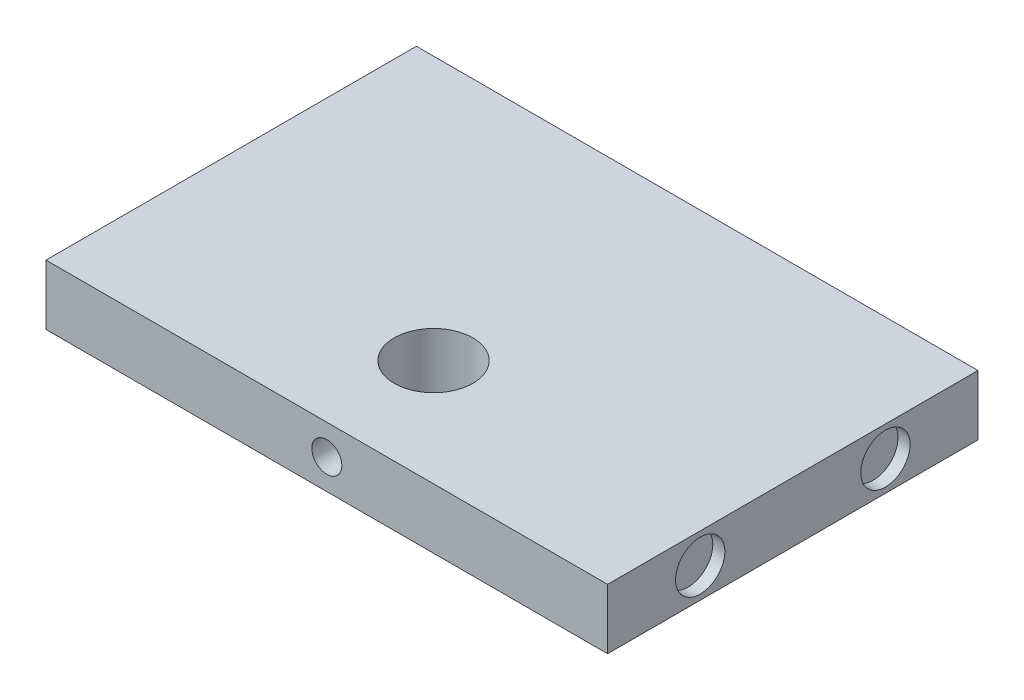
ISO-10303-21;
HEADER;
FILE_DESCRIPTION(('STEP AP214'),'2;1');
FILE_NAME('part.step','',(''),(''),'','','');
FILE_SCHEMA(('AUTOMOTIVE_DESIGN { 1 0 10303 214 1 1 1 1 }'));
ENDSEC;
DATA;
#1=APPLICATION_CONTEXT('core data for automotive mechanical design processes');
#2=APPLICATION_PROTOCOL_DEFINITION('international standard','automotive_design',2000,#1);
#3=PRODUCT_CONTEXT('',#1,'mechanical');
#4=PRODUCT('Part','Part','',(#3));
#5=PRODUCT_RELATED_PRODUCT_CATEGORY('part','',(#4));
#6=PRODUCT_DEFINITION_FORMATION('','',#4);
#7=PRODUCT_DEFINITION_CONTEXT('part definition',#1,'design');
#8=PRODUCT_DEFINITION('design','',#6,#7);
#9=PRODUCT_DEFINITION_SHAPE('','',#8);
#10=(LENGTH_UNIT() NAMED_UNIT(*) SI_UNIT(.MILLI.,.METRE.));
#11=(NAMED_UNIT(*) PLANE_ANGLE_UNIT() SI_UNIT($,.RADIAN.));
#12=(NAMED_UNIT(*) SI_UNIT($,.STERADIAN.) SOLID_ANGLE_UNIT());
#13=UNCERTAINTY_MEASURE_WITH_UNIT(LENGTH_MEASURE(1.E-05),#10,'distance_accuracy_value','');
#14=(GEOMETRIC_REPRESENTATION_CONTEXT(3) GLOBAL_UNCERTAINTY_ASSIGNED_CONTEXT((#13)) GLOBAL_UNIT_ASSIGNED_CONTEXT((#10,
#11,#12)) REPRESENTATION_CONTEXT('',''));
#15=CARTESIAN_POINT('',(0.,0.,0.));
#16=DIRECTION('',(0.,0.,1.));
#17=DIRECTION('',(1.,0.,0.));
#18=AXIS2_PLACEMENT_3D('',#15,#16,#17);
#19=CARTESIAN_POINT('',(0.,10.,0.));
#20=DIRECTION('',(0.,1.,0.));
#21=DIRECTION('',(0.,0.,1.));
#22=AXIS2_PLACEMENT_3D('',#19,#20,#21);
#23=PLANE('',#22);
#24=DIRECTION('',(0.,0.,1.));
#25=VECTOR('',#24,1.);
#26=CARTESIAN_POINT('',(-46.7,10.,30.8));
#27=LINE('',#26,#25);
#28=CARTESIAN_POINT('',(-46.7,10.,-30.8));
#29=VERTEX_POINT('',#28);
#30=CARTESIAN_POINT('',(-46.7,10.,30.8));
#31=VERTEX_POINT('',#30);
#32=EDGE_CURVE('E91',#29,#31,#27,.T.);
#33=ORIENTED_EDGE('',*,*,#32,.T.);
#34=DIRECTION('',(1.,0.,0.));
#35=VECTOR('',#34,1.);
#36=CARTESIAN_POINT('',(46.7,10.,30.8));
#37=LINE('',#36,#35);
#38=CARTESIAN_POINT('',(46.7,10.,30.8));
#39=VERTEX_POINT('',#38);
#40=EDGE_CURVE('E86',#31,#39,#37,.T.);
#41=ORIENTED_EDGE('',*,*,#40,.T.);
#42=DIRECTION('',(0.,0.,-1.));
#43=VECTOR('',#42,1.);
#44=CARTESIAN_POINT('',(46.7,10.,30.8));
#45=LINE('',#44,#43);
#46=CARTESIAN_POINT('',(46.7,10.,-30.8));
#47=VERTEX_POINT('',#46);
#48=EDGE_CURVE('E89',#39,#47,#45,.T.);
#49=ORIENTED_EDGE('',*,*,#48,.T.);
#50=DIRECTION('',(-1.,0.,0.));
#51=VECTOR('',#50,1.);
#52=CARTESIAN_POINT('',(46.7,10.,-30.8));
#53=LINE('',#52,#51);
#54=EDGE_CURVE('E56',#47,#29,#53,.T.);
#55=ORIENTED_EDGE('',*,*,#54,.T.);
#56=EDGE_LOOP('',(#33,#41,#49,#55));
#57=FACE_BOUND('',#56,.T.);
#58=CARTESIAN_POINT('',(0.,10.,13.05));
#59=DIRECTION('',(0.,1.,0.));
#60=DIRECTION('',(0.,0.,1.));
#61=AXIS2_PLACEMENT_3D('',#58,#59,#60);
#62=CIRCLE('',#61,6.55);
#63=CARTESIAN_POINT('',(0.,10.,19.6));
#64=VERTEX_POINT('',#63);
#65=EDGE_CURVE('E106',#64,#64,#62,.T.);
#66=ORIENTED_EDGE('',*,*,#65,.F.);
#67=EDGE_LOOP('',(#66));
#68=FACE_BOUND('',#67,.T.);
#69=ADVANCED_FACE('F39',(#57,#68),#23,.T.);
#70=CARTESIAN_POINT('',(0.,0.,0.));
#71=DIRECTION('',(0.,1.,0.));
#72=DIRECTION('',(0.,0.,1.));
#73=AXIS2_PLACEMENT_3D('',#70,#71,#72);
#74=PLANE('',#73);
#75=DIRECTION('',(0.,0.,1.));
#76=VECTOR('',#75,1.);
#77=CARTESIAN_POINT('',(-46.7,0.,30.8));
#78=LINE('',#77,#76);
#79=CARTESIAN_POINT('',(-46.7,0.,-30.8));
#80=VERTEX_POINT('',#79);
#81=CARTESIAN_POINT('',(-46.7,0.,30.8));
#82=VERTEX_POINT('',#81);
#83=EDGE_CURVE('E103',#80,#82,#78,.T.);
#84=ORIENTED_EDGE('',*,*,#83,.F.);
#85=DIRECTION('',(-1.,0.,0.));
#86=VECTOR('',#85,1.);
#87=CARTESIAN_POINT('',(46.7,0.,-30.8));
#88=LINE('',#87,#86);
#89=CARTESIAN_POINT('',(46.7,0.,-30.8));
#90=VERTEX_POINT('',#89);
#91=EDGE_CURVE('E79',#90,#80,#88,.T.);
#92=ORIENTED_EDGE('',*,*,#91,.F.);
#93=DIRECTION('',(0.,0.,-1.));
#94=VECTOR('',#93,1.);
#95=CARTESIAN_POINT('',(46.7,0.,30.8));
#96=LINE('',#95,#94);
#97=CARTESIAN_POINT('',(46.7,0.,30.8));
#98=VERTEX_POINT('',#97);
#99=EDGE_CURVE('E73',#98,#90,#96,.T.);
#100=ORIENTED_EDGE('',*,*,#99,.F.);
#101=DIRECTION('',(1.,0.,0.));
#102=VECTOR('',#101,1.);
#103=CARTESIAN_POINT('',(46.7,0.,30.8));
#104=LINE('',#103,#102);
#105=EDGE_CURVE('E95',#82,#98,#104,.T.);
#106=ORIENTED_EDGE('',*,*,#105,.F.);
#107=EDGE_LOOP('',(#84,#92,#100,#106));
#108=FACE_BOUND('',#107,.T.);
#109=CARTESIAN_POINT('',(0.,0.,13.05));
#110=DIRECTION('',(0.,1.,0.));
#111=DIRECTION('',(0.,0.,1.));
#112=AXIS2_PLACEMENT_3D('',#109,#110,#111);
#113=CIRCLE('',#112,6.55);
#114=CARTESIAN_POINT('',(0.,0.,19.6));
#115=VERTEX_POINT('',#114);
#116=EDGE_CURVE('E118',#115,#115,#113,.T.);
#117=ORIENTED_EDGE('',*,*,#116,.T.);
#118=EDGE_LOOP('',(#117));
#119=FACE_BOUND('',#118,.T.);
#120=ADVANCED_FACE('F114',(#108,#119),#74,.F.);
#121=CARTESIAN_POINT('',(-46.7,10.,30.8));
#122=DIRECTION('',(1.,0.,0.));
#123=DIRECTION('',(0.,0.,-1.));
#124=AXIS2_PLACEMENT_3D('',#121,#122,#123);
#125=PLANE('',#124);
#126=CARTESIAN_POINT('',(-46.7,5.,-15.4));
#127=DIRECTION('',(-1.,0.,0.));
#128=DIRECTION('',(0.,0.,1.));
#129=AXIS2_PLACEMENT_3D('',#126,#127,#128);
#130=CIRCLE('',#129,4.1);
#131=CARTESIAN_POINT('',(-46.7,5.,-11.3));
#132=VERTEX_POINT('',#131);
#133=EDGE_CURVE('E131',#132,#132,#130,.T.);
#134=ORIENTED_EDGE('',*,*,#133,.F.);
#135=EDGE_LOOP('',(#134));
#136=FACE_BOUND('',#135,.T.);
#137=CARTESIAN_POINT('',(-46.7,5.,15.4));
#138=DIRECTION('',(-1.,0.,0.));
#139=DIRECTION('',(0.,0.,-1.));
#140=AXIS2_PLACEMENT_3D('',#137,#138,#139);
#141=CIRCLE('',#140,4.1);
#142=CARTESIAN_POINT('',(-46.7,5.,11.3));
#143=VERTEX_POINT('',#142);
#144=EDGE_CURVE('E127',#143,#143,#141,.T.);
#145=ORIENTED_EDGE('',*,*,#144,.F.);
#146=EDGE_LOOP('',(#145));
#147=FACE_BOUND('',#146,.T.);
#148=ORIENTED_EDGE('',*,*,#83,.T.);
#149=DIRECTION('',(0.,-1.,0.));
#150=VECTOR('',#149,1.);
#151=CARTESIAN_POINT('',(-46.7,10.,30.8));
#152=LINE('',#151,#150);
#153=EDGE_CURVE('E11',#31,#82,#152,.T.);
#154=ORIENTED_EDGE('',*,*,#153,.F.);
#155=ORIENTED_EDGE('',*,*,#32,.F.);
#156=DIRECTION('',(0.,-1.,0.));
#157=VECTOR('',#156,1.);
#158=CARTESIAN_POINT('',(-46.7,10.,-30.8));
#159=LINE('',#158,#157);
#160=EDGE_CURVE('E99',#29,#80,#159,.T.);
#161=ORIENTED_EDGE('',*,*,#160,.T.);
#162=EDGE_LOOP('',(#148,#154,#155,#161));
#163=FACE_BOUND('',#162,.T.);
#164=ADVANCED_FACE('F41',(#136,#147,#163),#125,.F.);
#165=CARTESIAN_POINT('',(46.7,10.,30.8));
#166=DIRECTION('',(0.,0.,-1.));
#167=DIRECTION('',(-1.,0.,0.));
#168=AXIS2_PLACEMENT_3D('',#165,#166,#167);
#169=PLANE('',#168);
#170=CARTESIAN_POINT('',(0.,5.,30.8));
#171=DIRECTION('',(0.,0.,1.));
#172=DIRECTION('',(1.,0.,0.));
#173=AXIS2_PLACEMENT_3D('',#170,#171,#172);
#174=CIRCLE('',#173,2.5);
#175=CARTESIAN_POINT('',(2.5,5.,30.8));
#176=VERTEX_POINT('',#175);
#177=EDGE_CURVE('E140',#176,#176,#174,.T.);
#178=ORIENTED_EDGE('',*,*,#177,.F.);
#179=EDGE_LOOP('',(#178));
#180=FACE_BOUND('',#179,.T.);
#181=ORIENTED_EDGE('',*,*,#105,.T.);
#182=DIRECTION('',(0.,-1.,0.));
#183=VECTOR('',#182,1.);
#184=CARTESIAN_POINT('',(46.7,10.,30.8));
#185=LINE('',#184,#183);
#186=EDGE_CURVE('E48',#39,#98,#185,.T.);
#187=ORIENTED_EDGE('',*,*,#186,.F.);
#188=ORIENTED_EDGE('',*,*,#40,.F.);
#189=ORIENTED_EDGE('',*,*,#153,.T.);
#190=EDGE_LOOP('',(#181,#187,#188,#189));
#191=FACE_BOUND('',#190,.T.);
#192=ADVANCED_FACE('F94',(#180,#191),#169,.F.);
#193=CARTESIAN_POINT('',(46.7,10.,30.8));
#194=DIRECTION('',(-1.,0.,0.));
#195=DIRECTION('',(0.,0.,1.));
#196=AXIS2_PLACEMENT_3D('',#193,#194,#195);
#197=PLANE('',#196);
#198=CARTESIAN_POINT('',(46.7,5.,-15.4));
#199=DIRECTION('',(-1.,0.,0.));
#200=DIRECTION('',(0.,0.,1.));
#201=AXIS2_PLACEMENT_3D('',#198,#199,#200);
#202=CIRCLE('',#201,4.1);
#203=CARTESIAN_POINT('',(46.7,5.,-11.3));
#204=VERTEX_POINT('',#203);
#205=EDGE_CURVE('E143',#204,#204,#202,.T.);
#206=ORIENTED_EDGE('',*,*,#205,.T.);
#207=EDGE_LOOP('',(#206));
#208=FACE_BOUND('',#207,.T.);
#209=CARTESIAN_POINT('',(46.7,5.,15.4));
#210=DIRECTION('',(-1.,0.,0.));
#211=DIRECTION('',(0.,0.,-1.));
#212=AXIS2_PLACEMENT_3D('',#209,#210,#211);
#213=CIRCLE('',#212,4.1);
#214=CARTESIAN_POINT('',(46.7,5.,11.3));
#215=VERTEX_POINT('',#214);
#216=EDGE_CURVE('E136',#215,#215,#213,.T.);
#217=ORIENTED_EDGE('',*,*,#216,.T.);
#218=EDGE_LOOP('',(#217));
#219=FACE_BOUND('',#218,.T.);
#220=ORIENTED_EDGE('',*,*,#99,.T.);
#221=DIRECTION('',(0.,-1.,0.));
#222=VECTOR('',#221,1.);
#223=CARTESIAN_POINT('',(46.7,10.,-30.8));
#224=LINE('',#223,#222);
#225=EDGE_CURVE('E96',#47,#90,#224,.T.);
#226=ORIENTED_EDGE('',*,*,#225,.F.);
#227=ORIENTED_EDGE('',*,*,#48,.F.);
#228=ORIENTED_EDGE('',*,*,#186,.T.);
#229=EDGE_LOOP('',(#220,#226,#227,#228));
#230=FACE_BOUND('',#229,.T.);
#231=ADVANCED_FACE('F97',(#208,#219,#230),#197,.F.);
#232=CARTESIAN_POINT('',(46.7,10.,-30.8));
#233=DIRECTION('',(0.,0.,1.));
#234=DIRECTION('',(1.,0.,0.));
#235=AXIS2_PLACEMENT_3D('',#232,#233,#234);
#236=PLANE('',#235);
#237=ORIENTED_EDGE('',*,*,#91,.T.);
#238=ORIENTED_EDGE('',*,*,#160,.F.);
#239=ORIENTED_EDGE('',*,*,#54,.F.);
#240=ORIENTED_EDGE('',*,*,#225,.T.);
#241=EDGE_LOOP('',(#237,#238,#239,#240));
#242=FACE_BOUND('',#241,.T.);
#243=ADVANCED_FACE('F111',(#242),#236,.F.);
#244=CARTESIAN_POINT('',(0.,10.,13.05));
#245=DIRECTION('',(0.,-1.,0.));
#246=DIRECTION('',(0.,0.,-1.));
#247=AXIS2_PLACEMENT_3D('',#244,#245,#246);
#248=CYLINDRICAL_SURFACE('',#247,6.55);
#249=CARTESIAN_POINT('',(2.5,5.,19.1041308211832));
#250=CARTESIAN_POINT('',(2.50000597581389,5.13481281669022,19.1041251320415));
#251=CARTESIAN_POINT('',(2.48905920182154,5.26958712159651,19.1086826060039));
#252=CARTESIAN_POINT('',(2.44577025817923,5.53506075248647,19.126285799445));
#253=CARTESIAN_POINT('',(2.41342931566333,5.66576031174058,19.1393310320792));
#254=CARTESIAN_POINT('',(2.3287209699945,5.91917208605854,19.1722213180272));
#255=CARTESIAN_POINT('',(2.27640310736123,6.04190318804779,19.1920495377319));
#256=CARTESIAN_POINT('',(2.1534023939893,6.27689460982429,19.2362440675147));
#257=CARTESIAN_POINT('',(2.08271382214451,6.38915165289608,19.2606117906389));
#258=CARTESIAN_POINT('',(1.92107731524571,6.60579321022366,19.3125461951997));
#259=CARTESIAN_POINT('',(1.82933517438893,6.70956221693971,19.3402092767056));
#260=CARTESIAN_POINT('',(1.62987918120905,6.90067822438357,19.3948149036664));
#261=CARTESIAN_POINT('',(1.52216177204387,6.98802155814075,19.4217572870795));
#262=CARTESIAN_POINT('',(1.28911144265205,7.14680204186814,19.4730369092061));
#263=CARTESIAN_POINT('',(1.16328961702604,7.21756598639166,19.4972480255216));
#264=CARTESIAN_POINT('',(0.900439156402321,7.33666540476869,19.5391743385083));
#265=CARTESIAN_POINT('',(0.763414579941273,7.38500895910847,19.5568918750336));
#266=CARTESIAN_POINT('',(0.488522121510804,7.45572407304055,19.5831500801332));
#267=CARTESIAN_POINT('',(0.3509634475184,7.4791562155726,19.5920642311101));
#268=CARTESIAN_POINT('',(0.0735966964608953,7.50278604566727,19.6010541407955));
#269=CARTESIAN_POINT('',(-0.0662106069796278,7.50299156011752,19.6011328768539));
#270=CARTESIAN_POINT('',(-0.336487416487367,7.48077043552324,19.5926779490987));
#271=CARTESIAN_POINT('',(-0.467068407753809,7.45950253946783,19.5845852299131));
#272=CARTESIAN_POINT('',(-0.722646071755101,7.39689318761337,19.5612792282279));
#273=CARTESIAN_POINT('',(-0.8476423468851,7.35555030505106,19.5460654396246));
#274=CARTESIAN_POINT('',(-1.09069041552946,7.2534485021302,19.5097390414119));
#275=CARTESIAN_POINT('',(-1.20861292996744,7.19241278323093,19.4885429118616));
#276=CARTESIAN_POINT('',(-1.43283834237801,7.05290642555019,19.4423859395392));
#277=CARTESIAN_POINT('',(-1.53913740415186,6.9744300564228,19.4174238602844));
#278=CARTESIAN_POINT('',(-1.74390862760734,6.79673310475465,19.3645179435542));
#279=CARTESIAN_POINT('',(-1.841520185764,6.69654583186291,19.3364850736439));
#280=CARTESIAN_POINT('',(-2.0188883154685,6.4810706029197,19.2817914138271));
#281=CARTESIAN_POINT('',(-2.09864006507836,6.36577858204924,19.2551309959592));
#282=CARTESIAN_POINT('',(-2.23975174693389,6.11985352546305,19.2056279002759));
#283=CARTESIAN_POINT('',(-2.30063071682444,5.98892154114034,19.1828907420823));
#284=CARTESIAN_POINT('',(-2.39914570126494,5.71756656344801,19.1450322859471));
#285=CARTESIAN_POINT('',(-2.43679521025293,5.5771491330597,19.1299065673185));
#286=CARTESIAN_POINT('',(-2.48578944738378,5.29933699637517,19.1100342088773));
#287=CARTESIAN_POINT('',(-2.49850624696311,5.16222328303433,19.1047470621767));
#288=CARTESIAN_POINT('',(-2.50124402276495,4.88774917342692,19.103617700945));
#289=CARTESIAN_POINT('',(-2.49127096958449,4.75038885155675,19.1077730017323));
#290=CARTESIAN_POINT('',(-2.45015765264515,4.48650693974699,19.124509846915));
#291=CARTESIAN_POINT('',(-2.42009797483307,4.35978646216391,19.1366607708259));
#292=CARTESIAN_POINT('',(-2.34103527083642,4.11325243138241,19.1675028724459));
#293=CARTESIAN_POINT('',(-2.29202827945532,3.9934403299686,19.1861954190744));
#294=CARTESIAN_POINT('',(-2.17435199386903,3.75901169220988,19.2288949810422));
#295=CARTESIAN_POINT('',(-2.1050008678604,3.64477048786686,19.2530782800991));
#296=CARTESIAN_POINT('',(-1.94932275902907,3.42906137993536,19.3037455494887));
#297=CARTESIAN_POINT('',(-1.862989372714,3.32759831833927,19.3302303855515));
#298=CARTESIAN_POINT('',(-1.66904958238838,3.13336552943563,19.3846314795537));
#299=CARTESIAN_POINT('',(-1.56041431040615,3.04161358845547,19.4125266513203));
#300=CARTESIAN_POINT('',(-1.32860850902128,2.87751062945112,19.4649358177479));
#301=CARTESIAN_POINT('',(-1.20543780292961,2.80515984729747,19.4894497712999));
#302=CARTESIAN_POINT('',(-0.948013261440525,2.68234098711379,19.53233991708));
#303=CARTESIAN_POINT('',(-0.813790337851832,2.63181418960797,19.5507325482738));
#304=CARTESIAN_POINT('',(-0.537884368398438,2.5543541233138,19.5793470958823));
#305=CARTESIAN_POINT('',(-0.396205006654785,2.52740931688655,19.5895730077018));
#306=CARTESIAN_POINT('',(-0.1185907359226,2.49915534878287,19.6003107732321));
#307=CARTESIAN_POINT('',(0.0171772973662682,2.49640207572364,19.6013697838267));
#308=CARTESIAN_POINT('',(0.287162251523454,2.51286877509592,19.5950945268615));
#309=CARTESIAN_POINT('',(0.421379368776751,2.53208593402608,19.587761333995));
#310=CARTESIAN_POINT('',(0.680899977029763,2.59092812313427,19.5657818917338));
#311=CARTESIAN_POINT('',(0.80634447747272,2.63000971347147,19.5513306831159));
#312=CARTESIAN_POINT('',(1.04889763757919,2.72692269082992,19.5166327923829));
#313=CARTESIAN_POINT('',(1.16600471329613,2.78475762908727,19.4963850126825));
#314=CARTESIAN_POINT('',(1.39403963587308,2.92033796701871,19.4510348552319));
#315=CARTESIAN_POINT('',(1.50449023897585,2.99882797371808,19.4257621287319));
#316=CARTESIAN_POINT('',(1.71109297978644,3.17233087353896,19.3734514129848));
#317=CARTESIAN_POINT('',(1.80723992065783,3.26734974489506,19.3464127872569));
#318=CARTESIAN_POINT('',(1.9879719619888,3.4774358212894,19.291784593018));
#319=CARTESIAN_POINT('',(2.07162732438424,3.59331954720484,19.264246842351));
#320=CARTESIAN_POINT('',(2.21833287610032,3.8383655424249,19.2134040453697));
#321=CARTESIAN_POINT('',(2.28137947193863,3.96753012231207,19.1900997375411));
#322=CARTESIAN_POINT('',(2.38773587280385,4.24377434958479,19.149564355972));
#323=CARTESIAN_POINT('',(2.4296530398653,4.39146220631832,19.132775550883));
#324=CARTESIAN_POINT('',(2.48577158972363,4.69278631803829,19.1100659883175));
#325=CARTESIAN_POINT('',(2.49999319221589,4.84641814987131,19.1041373023837));
#326=CARTESIAN_POINT('',(2.5,5.,19.1041308211832));
#327=B_SPLINE_CURVE_WITH_KNOTS('',3,(#249,#250,#251,#252,#253,#254,#255,#256,#257,#258,#259,
#260,#261,#262,#263,#264,#265,#266,#267,#268,#269,#270,#271,#272,#273,#274,#275,#276,#277,#278,
#279,#280,#281,#282,#283,#284,#285,#286,#287,#288,#289,#290,#291,#292,#293,#294,#295,#296,#297,
#298,#299,#300,#301,#302,#303,#304,#305,#306,#307,#308,#309,#310,#311,#312,#313,#314,#315,#316,
#317,#318,#319,#320,#321,#322,#323,#324,#325,#326),.UNSPECIFIED.,.T.,.F.,(4,2,2,2,2,2,2,2,2,2,2,
2,2,2,2,2,2,2,2,2,2,2,2,2,2,2,2,2,2,2,2,2,2,2,2,2,2,2,4),(0.,0.403866033586921,
0.807708904095777,1.21055672639386,1.61353015640433,2.03538911507763,2.45734214068968,
2.89424512598691,3.33099052538351,3.74828943692639,4.16544772704918,4.56123800260072,
4.95705641175479,5.3587002364025,5.76047622181437,6.18652069703663,6.61268006094242,
7.04894479334528,7.4849558520159,7.89621283894034,8.30736162041468,8.69800318405025,
9.08872654343654,9.49443065933214,9.90028804814127,10.332969737216,10.7656566864011,
11.1971720868304,11.6284762473973,12.0338448916359,12.4391616307733,12.8339430810049,
13.2287993329036,13.6405127869043,14.0523754620867,14.4869462223342,14.9215927168752,
15.3820224293192,15.8421158697296),.UNSPECIFIED.);
#328=CARTESIAN_POINT('',(2.5,5.,19.1041308211832));
#329=VERTEX_POINT('',#328);
#330=EDGE_CURVE('E148',#329,#329,#327,.T.);
#331=ORIENTED_EDGE('',*,*,#330,.T.);
#332=EDGE_LOOP('',(#331));
#333=FACE_BOUND('',#332,.T.);
#334=ORIENTED_EDGE('',*,*,#65,.T.);
#335=EDGE_LOOP('',(#334));
#336=FACE_BOUND('',#335,.T.);
#337=ORIENTED_EDGE('',*,*,#116,.F.);
#338=EDGE_LOOP('',(#337));
#339=FACE_BOUND('',#338,.T.);
#340=ADVANCED_FACE('F190',(#333,#336,#339),#248,.F.);
#341=CARTESIAN_POINT('',(-44.7,5.,15.4));
#342=DIRECTION('',(-1.,0.,0.));
#343=DIRECTION('',(0.,0.,1.));
#344=AXIS2_PLACEMENT_3D('',#341,#342,#343);
#345=CYLINDRICAL_SURFACE('',#344,4.1);
#346=CARTESIAN_POINT('',(-44.7,5.,15.4));
#347=DIRECTION('',(-1.,0.,0.));
#348=DIRECTION('',(0.,0.,-1.));
#349=AXIS2_PLACEMENT_3D('',#346,#347,#348);
#350=CIRCLE('',#349,4.1);
#351=CARTESIAN_POINT('',(-44.7,5.,11.3));
#352=VERTEX_POINT('',#351);
#353=EDGE_CURVE('E124',#352,#352,#350,.T.);
#354=ORIENTED_EDGE('',*,*,#353,.F.);
#355=EDGE_LOOP('',(#354));
#356=FACE_BOUND('',#355,.T.);
#357=ORIENTED_EDGE('',*,*,#144,.T.);
#358=EDGE_LOOP('',(#357));
#359=FACE_BOUND('',#358,.T.);
#360=ADVANCED_FACE('F187',(#356,#359),#345,.F.);
#361=CARTESIAN_POINT('',(-44.7,5.,15.4));
#362=DIRECTION('',(1.,0.,0.));
#363=DIRECTION('',(0.,0.,-1.));
#364=AXIS2_PLACEMENT_3D('',#361,#362,#363);
#365=PLANE('',#364);
#366=ORIENTED_EDGE('',*,*,#353,.T.);
#367=EDGE_LOOP('',(#366));
#368=FACE_BOUND('',#367,.T.);
#369=ADVANCED_FACE('F185',(#368),#365,.F.);
#370=CARTESIAN_POINT('',(-44.7,5.,-15.4));
#371=DIRECTION('',(-1.,0.,0.));
#372=DIRECTION('',(0.,0.,1.));
#373=AXIS2_PLACEMENT_3D('',#370,#371,#372);
#374=CYLINDRICAL_SURFACE('',#373,4.1);
#375=CARTESIAN_POINT('',(-44.7,5.,-15.4));
#376=DIRECTION('',(-1.,0.,0.));
#377=DIRECTION('',(0.,0.,1.));
#378=AXIS2_PLACEMENT_3D('',#375,#376,#377);
#379=CIRCLE('',#378,4.1);
#380=CARTESIAN_POINT('',(-44.7,5.,-11.3));
#381=VERTEX_POINT('',#380);
#382=EDGE_CURVE('E121',#381,#381,#379,.T.);
#383=ORIENTED_EDGE('',*,*,#382,.F.);
#384=EDGE_LOOP('',(#383));
#385=FACE_BOUND('',#384,.T.);
#386=ORIENTED_EDGE('',*,*,#133,.T.);
#387=EDGE_LOOP('',(#386));
#388=FACE_BOUND('',#387,.T.);
#389=ADVANCED_FACE('F181',(#385,#388),#374,.F.);
#390=CARTESIAN_POINT('',(-44.7,5.,-15.4));
#391=DIRECTION('',(-1.,0.,0.));
#392=DIRECTION('',(0.,0.,1.));
#393=AXIS2_PLACEMENT_3D('',#390,#391,#392);
#394=PLANE('',#393);
#395=ORIENTED_EDGE('',*,*,#382,.T.);
#396=EDGE_LOOP('',(#395));
#397=FACE_BOUND('',#396,.T.);
#398=ADVANCED_FACE('F177',(#397),#394,.T.);
#399=CARTESIAN_POINT('',(44.7,5.,15.4));
#400=DIRECTION('',(1.,0.,0.));
#401=DIRECTION('',(0.,0.,-1.));
#402=AXIS2_PLACEMENT_3D('',#399,#400,#401);
#403=CYLINDRICAL_SURFACE('',#402,4.1);
#404=CARTESIAN_POINT('',(44.7,5.,15.4));
#405=DIRECTION('',(-1.,0.,0.));
#406=DIRECTION('',(0.,0.,-1.));
#407=AXIS2_PLACEMENT_3D('',#404,#405,#406);
#408=CIRCLE('',#407,4.1);
#409=CARTESIAN_POINT('',(44.7,5.,11.3));
#410=VERTEX_POINT('',#409);
#411=EDGE_CURVE('E139',#410,#410,#408,.T.);
#412=ORIENTED_EDGE('',*,*,#411,.T.);
#413=EDGE_LOOP('',(#412));
#414=FACE_BOUND('',#413,.T.);
#415=ORIENTED_EDGE('',*,*,#216,.F.);
#416=EDGE_LOOP('',(#415));
#417=FACE_BOUND('',#416,.T.);
#418=ADVANCED_FACE('F173',(#414,#417),#403,.F.);
#419=CARTESIAN_POINT('',(44.7,5.,15.4));
#420=DIRECTION('',(-1.,0.,0.));
#421=DIRECTION('',(0.,0.,-1.));
#422=AXIS2_PLACEMENT_3D('',#419,#420,#421);
#423=PLANE('',#422);
#424=ORIENTED_EDGE('',*,*,#411,.F.);
#425=EDGE_LOOP('',(#424));
#426=FACE_BOUND('',#425,.T.);
#427=ADVANCED_FACE('F169',(#426),#423,.F.);
#428=CARTESIAN_POINT('',(44.7,5.,-15.4));
#429=DIRECTION('',(1.,0.,0.));
#430=DIRECTION('',(0.,0.,-1.));
#431=AXIS2_PLACEMENT_3D('',#428,#429,#430);
#432=CYLINDRICAL_SURFACE('',#431,4.1);
#433=CARTESIAN_POINT('',(44.7,5.,-15.4));
#434=DIRECTION('',(-1.,0.,0.));
#435=DIRECTION('',(0.,0.,1.));
#436=AXIS2_PLACEMENT_3D('',#433,#434,#435);
#437=CIRCLE('',#436,4.1);
#438=CARTESIAN_POINT('',(44.7,5.,-11.3));
#439=VERTEX_POINT('',#438);
#440=EDGE_CURVE('E128',#439,#439,#437,.T.);
#441=ORIENTED_EDGE('',*,*,#440,.T.);
#442=EDGE_LOOP('',(#441));
#443=FACE_BOUND('',#442,.T.);
#444=ORIENTED_EDGE('',*,*,#205,.F.);
#445=EDGE_LOOP('',(#444));
#446=FACE_BOUND('',#445,.T.);
#447=ADVANCED_FACE('F165',(#443,#446),#432,.F.);
#448=CARTESIAN_POINT('',(44.7,5.,-15.4));
#449=DIRECTION('',(1.,0.,0.));
#450=DIRECTION('',(0.,0.,1.));
#451=AXIS2_PLACEMENT_3D('',#448,#449,#450);
#452=PLANE('',#451);
#453=ORIENTED_EDGE('',*,*,#440,.F.);
#454=EDGE_LOOP('',(#453));
#455=FACE_BOUND('',#454,.T.);
#456=ADVANCED_FACE('F161',(#455),#452,.T.);
#457=CARTESIAN_POINT('',(0.,5.,-30.801));
#458=DIRECTION('',(0.,0.,1.));
#459=DIRECTION('',(1.,0.,0.));
#460=AXIS2_PLACEMENT_3D('',#457,#458,#459);
#461=CYLINDRICAL_SURFACE('',#460,2.5);
#462=ORIENTED_EDGE('',*,*,#330,.F.);
#463=EDGE_LOOP('',(#462));
#464=FACE_BOUND('',#463,.T.);
#465=ORIENTED_EDGE('',*,*,#177,.T.);
#466=EDGE_LOOP('',(#465));
#467=FACE_BOUND('',#466,.T.);
#468=ADVANCED_FACE('F156',(#464,#467),#461,.F.);
#469=CLOSED_SHELL('',(#69,#120,#164,#192,#231,#243,#340,#360,#369,#389,#398,#418,#427,#447,#456,#468));
#470=MANIFOLD_SOLID_BREP('B2',#469);
#471=ADVANCED_BREP_SHAPE_REPRESENTATION('',(#18,#470),#14);
#472=SHAPE_DEFINITION_REPRESENTATION(#9,#471);
ENDSEC;
END-ISO-10303-21;
